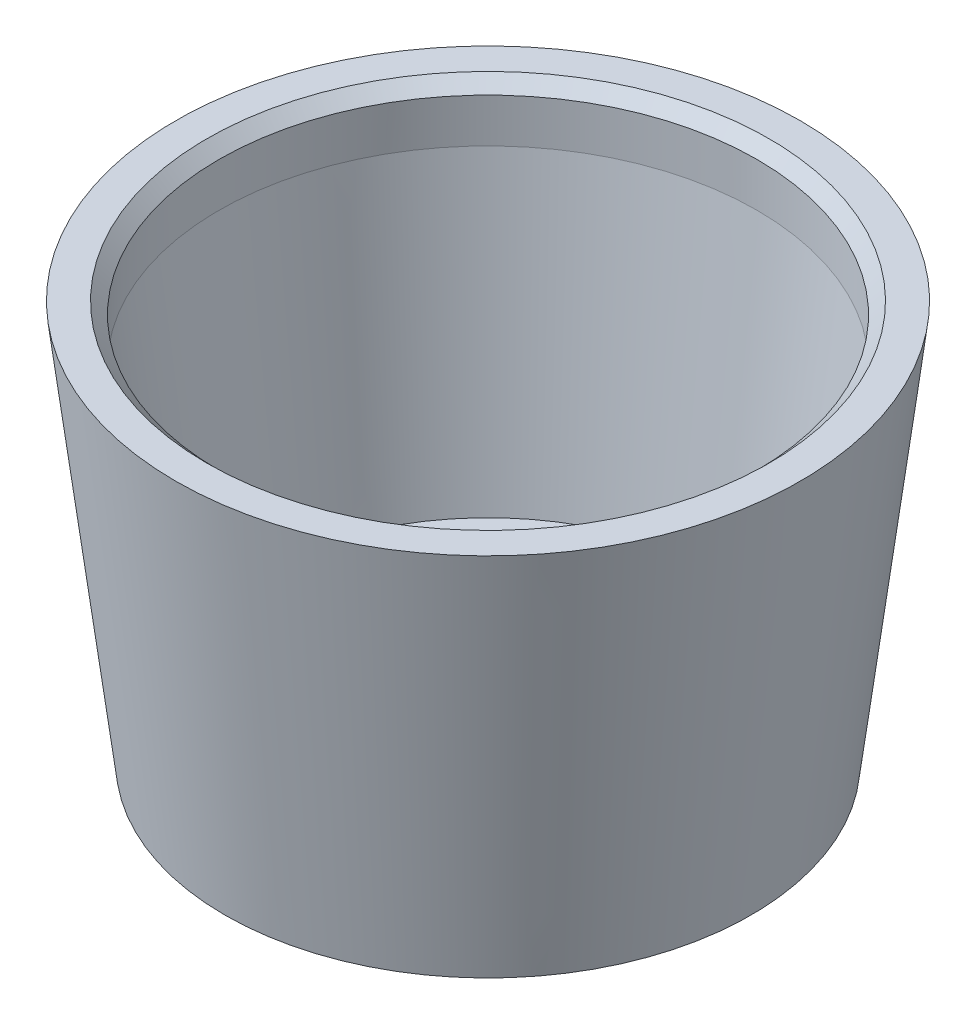
ISO-10303-21;
HEADER;
FILE_DESCRIPTION(('STEP AP214'),'2;1');
FILE_NAME('part.step','',(''),(''),'','','');
FILE_SCHEMA(('AUTOMOTIVE_DESIGN { 1 0 10303 214 1 1 1 1 }'));
ENDSEC;
DATA;
#1=APPLICATION_CONTEXT('core data for automotive mechanical design processes');
#2=APPLICATION_PROTOCOL_DEFINITION('international standard','automotive_design',2000,#1);
#3=PRODUCT_CONTEXT('',#1,'mechanical');
#4=PRODUCT('Part','Part','',(#3));
#5=PRODUCT_RELATED_PRODUCT_CATEGORY('part','',(#4));
#6=PRODUCT_DEFINITION_FORMATION('','',#4);
#7=PRODUCT_DEFINITION_CONTEXT('part definition',#1,'design');
#8=PRODUCT_DEFINITION('design','',#6,#7);
#9=PRODUCT_DEFINITION_SHAPE('','',#8);
#10=(LENGTH_UNIT() NAMED_UNIT(*) SI_UNIT(.MILLI.,.METRE.));
#11=(NAMED_UNIT(*) PLANE_ANGLE_UNIT() SI_UNIT($,.RADIAN.));
#12=(NAMED_UNIT(*) SI_UNIT($,.STERADIAN.) SOLID_ANGLE_UNIT());
#13=UNCERTAINTY_MEASURE_WITH_UNIT(LENGTH_MEASURE(1.E-05),#10,'distance_accuracy_value','');
#14=(GEOMETRIC_REPRESENTATION_CONTEXT(3) GLOBAL_UNCERTAINTY_ASSIGNED_CONTEXT((#13)) GLOBAL_UNIT_ASSIGNED_CONTEXT((#10,
#11,#12)) REPRESENTATION_CONTEXT('',''));
#15=CARTESIAN_POINT('',(0.,0.,0.));
#16=DIRECTION('',(0.,0.,1.));
#17=DIRECTION('',(1.,0.,0.));
#18=AXIS2_PLACEMENT_3D('',#15,#16,#17);
#19=CARTESIAN_POINT('',(0.,0.,-41.733180382666));
#20=DIRECTION('',(0.,-1.,0.));
#21=DIRECTION('',(0.,0.,-1.));
#22=AXIS2_PLACEMENT_3D('',#19,#20,#21);
#23=PLANE('',#22);
#24=CARTESIAN_POINT('',(0.,0.,0.));
#25=DIRECTION('',(0.,-1.,0.));
#26=DIRECTION('',(0.,0.,-1.));
#27=AXIS2_PLACEMENT_3D('',#24,#25,#26);
#28=CIRCLE('',#27,41.733180382666);
#29=CARTESIAN_POINT('',(0.,0.,-41.733180382666));
#30=VERTEX_POINT('',#29);
#31=EDGE_CURVE('E86',#30,#30,#28,.T.);
#32=ORIENTED_EDGE('',*,*,#31,.T.);
#33=EDGE_LOOP('',(#32));
#34=FACE_BOUND('',#33,.T.);
#35=CARTESIAN_POINT('',(0.,0.,0.));
#36=DIRECTION('',(0.,-1.,0.));
#37=DIRECTION('',(0.,0.,-1.));
#38=AXIS2_PLACEMENT_3D('',#35,#36,#37);
#39=CIRCLE('',#38,36.653180382666);
#40=CARTESIAN_POINT('',(0.,0.,-36.653180382666));
#41=VERTEX_POINT('',#40);
#42=EDGE_CURVE('E63',#41,#41,#39,.T.);
#43=ORIENTED_EDGE('',*,*,#42,.F.);
#44=EDGE_LOOP('',(#43));
#45=FACE_BOUND('',#44,.T.);
#46=ADVANCED_FACE('F49',(#34,#45),#23,.T.);
#47=CARTESIAN_POINT('',(0.,0.635,0.));
#48=DIRECTION('',(0.,-1.,0.));
#49=DIRECTION('',(0.,0.,-1.));
#50=AXIS2_PLACEMENT_3D('',#47,#48,#49);
#51=CONICAL_SURFACE('',#50,36.018180382666,0.785398163397451);
#52=ORIENTED_EDGE('',*,*,#42,.T.);
#53=EDGE_LOOP('',(#52));
#54=FACE_BOUND('',#53,.T.);
#55=CARTESIAN_POINT('',(0.,0.635,0.));
#56=DIRECTION('',(0.,-1.,0.));
#57=DIRECTION('',(0.,0.,-1.));
#58=AXIS2_PLACEMENT_3D('',#55,#56,#57);
#59=CIRCLE('',#58,36.018180382666);
#60=CARTESIAN_POINT('',(0.,0.635,-36.018180382666));
#61=VERTEX_POINT('',#60);
#62=EDGE_CURVE('E68',#61,#61,#59,.T.);
#63=ORIENTED_EDGE('',*,*,#62,.F.);
#64=EDGE_LOOP('',(#63));
#65=FACE_BOUND('',#64,.T.);
#66=ADVANCED_FACE('F106',(#54,#65),#51,.F.);
#67=CARTESIAN_POINT('',(0.,0.634999999999998,-36.018180382666));
#68=DIRECTION('',(0.,-1.,0.));
#69=DIRECTION('',(0.,0.,-1.));
#70=AXIS2_PLACEMENT_3D('',#67,#68,#69);
#71=PLANE('',#70);
#72=ORIENTED_EDGE('',*,*,#62,.T.);
#73=EDGE_LOOP('',(#72));
#74=FACE_BOUND('',#73,.T.);
#75=ADVANCED_FACE('F110',(#74),#71,.T.);
#76=CARTESIAN_POINT('',(0.,7.62,-36.9108800842488));
#77=DIRECTION('',(0.,1.,0.));
#78=DIRECTION('',(0.,0.,1.));
#79=AXIS2_PLACEMENT_3D('',#76,#77,#78);
#80=PLANE('',#79);
#81=CARTESIAN_POINT('',(0.,7.62,0.));
#82=DIRECTION('',(0.,-1.,0.));
#83=DIRECTION('',(0.,0.,-1.));
#84=AXIS2_PLACEMENT_3D('',#81,#82,#83);
#85=CIRCLE('',#84,36.9108800842488);
#86=CARTESIAN_POINT('',(0.,7.62,-36.9108800842488));
#87=VERTEX_POINT('',#86);
#88=EDGE_CURVE('E74',#87,#87,#85,.T.);
#89=ORIENTED_EDGE('',*,*,#88,.F.);
#90=EDGE_LOOP('',(#89));
#91=FACE_BOUND('',#90,.T.);
#92=ADVANCED_FACE('F116',(#91),#80,.T.);
#93=CARTESIAN_POINT('',(0.,54.61,0.));
#94=DIRECTION('',(0.,1.,0.));
#95=DIRECTION('',(0.,0.,1.));
#96=AXIS2_PLACEMENT_3D('',#93,#94,#95);
#97=CONICAL_SURFACE('',#96,42.6805266010759,0.122173047639596);
#98=ORIENTED_EDGE('',*,*,#88,.T.);
#99=EDGE_LOOP('',(#98));
#100=FACE_BOUND('',#99,.T.);
#101=CARTESIAN_POINT('',(0.,54.61,0.));
#102=DIRECTION('',(0.,-1.,0.));
#103=DIRECTION('',(0.,0.,-1.));
#104=AXIS2_PLACEMENT_3D('',#101,#102,#103);
#105=CIRCLE('',#104,42.6805266010759);
#106=CARTESIAN_POINT('',(0.,54.61,-42.6805266010759));
#107=VERTEX_POINT('',#106);
#108=EDGE_CURVE('E78',#107,#107,#105,.T.);
#109=ORIENTED_EDGE('',*,*,#108,.F.);
#110=EDGE_LOOP('',(#109));
#111=FACE_BOUND('',#110,.T.);
#112=ADVANCED_FACE('F120',(#100,#111),#97,.F.);
#113=CARTESIAN_POINT('',(0.,0.,0.));
#114=DIRECTION('',(0.,-1.,0.));
#115=DIRECTION('',(0.,0.,-1.));
#116=AXIS2_PLACEMENT_3D('',#113,#114,#115);
#117=CYLINDRICAL_SURFACE('',#116,42.6805266010759);
#118=CARTESIAN_POINT('',(0.,61.595,0.));
#119=DIRECTION('',(0.,1.,0.));
#120=DIRECTION('',(0.,0.,1.));
#121=AXIS2_PLACEMENT_3D('',#118,#119,#120);
#122=CIRCLE('',#121,42.6805266010759);
#123=CARTESIAN_POINT('',(0.,61.595,42.6805266010759));
#124=VERTEX_POINT('',#123);
#125=EDGE_CURVE('E10',#124,#124,#122,.T.);
#126=ORIENTED_EDGE('',*,*,#125,.T.);
#127=EDGE_LOOP('',(#126));
#128=FACE_BOUND('',#127,.T.);
#129=ORIENTED_EDGE('',*,*,#108,.T.);
#130=EDGE_LOOP('',(#129));
#131=FACE_BOUND('',#130,.T.);
#132=ADVANCED_FACE('F103',(#128,#131),#117,.F.);
#133=CARTESIAN_POINT('',(0.,63.5,-49.53));
#134=DIRECTION('',(0.,1.,0.));
#135=DIRECTION('',(0.,0.,1.));
#136=AXIS2_PLACEMENT_3D('',#133,#134,#135);
#137=PLANE('',#136);
#138=CARTESIAN_POINT('',(0.,63.5,0.));
#139=DIRECTION('',(0.,1.,0.));
#140=DIRECTION('',(0.,0.,1.));
#141=AXIS2_PLACEMENT_3D('',#138,#139,#140);
#142=CIRCLE('',#141,44.5855266010759);
#143=CARTESIAN_POINT('',(0.,63.5,44.5855266010759));
#144=VERTEX_POINT('',#143);
#145=EDGE_CURVE('E58',#144,#144,#142,.F.);
#146=ORIENTED_EDGE('',*,*,#145,.T.);
#147=EDGE_LOOP('',(#146));
#148=FACE_BOUND('',#147,.T.);
#149=CARTESIAN_POINT('',(0.,63.5,0.));
#150=DIRECTION('',(0.,-1.,0.));
#151=DIRECTION('',(0.,0.,-1.));
#152=AXIS2_PLACEMENT_3D('',#149,#150,#151);
#153=CIRCLE('',#152,49.53);
#154=CARTESIAN_POINT('',(0.,63.5,-49.53));
#155=VERTEX_POINT('',#154);
#156=EDGE_CURVE('E82',#155,#155,#153,.T.);
#157=ORIENTED_EDGE('',*,*,#156,.F.);
#158=EDGE_LOOP('',(#157));
#159=FACE_BOUND('',#158,.T.);
#160=ADVANCED_FACE('F95',(#148,#159),#137,.T.);
#161=CARTESIAN_POINT('',(0.,0.,0.));
#162=DIRECTION('',(0.,1.,0.));
#163=DIRECTION('',(0.,0.,1.));
#164=AXIS2_PLACEMENT_3D('',#161,#162,#163);
#165=CONICAL_SURFACE('',#164,41.733180382666,0.122173047639596);
#166=ORIENTED_EDGE('',*,*,#156,.T.);
#167=EDGE_LOOP('',(#166));
#168=FACE_BOUND('',#167,.T.);
#169=ORIENTED_EDGE('',*,*,#31,.F.);
#170=EDGE_LOOP('',(#169));
#171=FACE_BOUND('',#170,.T.);
#172=ADVANCED_FACE('F93',(#168,#171),#165,.T.);
#173=CARTESIAN_POINT('',(0.,63.5,0.));
#174=DIRECTION('',(0.,1.,0.));
#175=DIRECTION('',(0.,0.,1.));
#176=AXIS2_PLACEMENT_3D('',#173,#174,#175);
#177=CONICAL_SURFACE('',#176,44.5855266010759,0.785398163397448);
#178=ORIENTED_EDGE('',*,*,#125,.F.);
#179=EDGE_LOOP('',(#178));
#180=FACE_BOUND('',#179,.T.);
#181=ORIENTED_EDGE('',*,*,#145,.F.);
#182=EDGE_LOOP('',(#181));
#183=FACE_BOUND('',#182,.T.);
#184=ADVANCED_FACE('F52',(#180,#183),#177,.F.);
#185=CLOSED_SHELL('',(#46,#66,#75,#92,#112,#132,#160,#172,#184));
#186=MANIFOLD_SOLID_BREP('B2',#185);
#187=ADVANCED_BREP_SHAPE_REPRESENTATION('',(#18,#186),#14);
#188=SHAPE_DEFINITION_REPRESENTATION(#9,#187);
ENDSEC;
END-ISO-10303-21;
